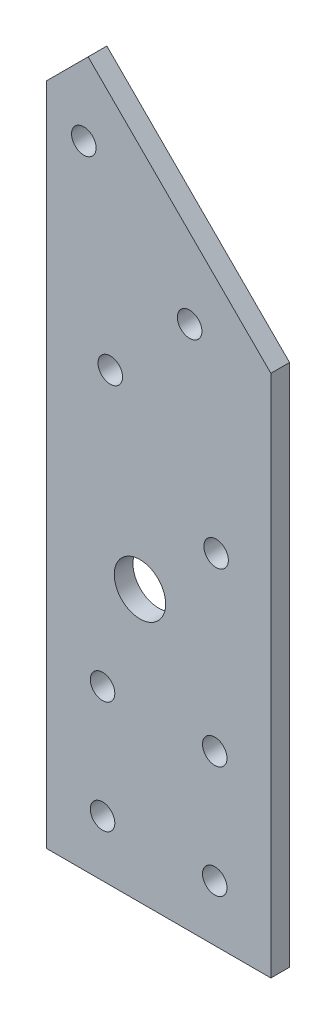
ISO-10303-21;
HEADER;
FILE_DESCRIPTION(('STEP AP214'),'2;1');
FILE_NAME('part.step','',(''),(''),'','','');
FILE_SCHEMA(('AUTOMOTIVE_DESIGN { 1 0 10303 214 1 1 1 1 }'));
ENDSEC;
DATA;
#1=APPLICATION_CONTEXT('core data for automotive mechanical design processes');
#2=APPLICATION_PROTOCOL_DEFINITION('international standard','automotive_design',2000,#1);
#3=PRODUCT_CONTEXT('',#1,'mechanical');
#4=PRODUCT('Part','Part','',(#3));
#5=PRODUCT_RELATED_PRODUCT_CATEGORY('part','',(#4));
#6=PRODUCT_DEFINITION_FORMATION('','',#4);
#7=PRODUCT_DEFINITION_CONTEXT('part definition',#1,'design');
#8=PRODUCT_DEFINITION('design','',#6,#7);
#9=PRODUCT_DEFINITION_SHAPE('','',#8);
#10=(LENGTH_UNIT() NAMED_UNIT(*) SI_UNIT(.MILLI.,.METRE.));
#11=(NAMED_UNIT(*) PLANE_ANGLE_UNIT() SI_UNIT($,.RADIAN.));
#12=(NAMED_UNIT(*) SI_UNIT($,.STERADIAN.) SOLID_ANGLE_UNIT());
#13=UNCERTAINTY_MEASURE_WITH_UNIT(LENGTH_MEASURE(1.E-05),#10,'distance_accuracy_value','');
#14=(GEOMETRIC_REPRESENTATION_CONTEXT(3) GLOBAL_UNCERTAINTY_ASSIGNED_CONTEXT((#13)) GLOBAL_UNIT_ASSIGNED_CONTEXT((#10,
#11,#12)) REPRESENTATION_CONTEXT('',''));
#15=CARTESIAN_POINT('',(0.,0.,0.));
#16=DIRECTION('',(0.,0.,1.));
#17=DIRECTION('',(1.,0.,0.));
#18=AXIS2_PLACEMENT_3D('',#15,#16,#17);
#19=CARTESIAN_POINT('',(19.05,57.15,6.35));
#20=DIRECTION('',(0.,0.,1.));
#21=DIRECTION('',(1.,0.,0.));
#22=AXIS2_PLACEMENT_3D('',#19,#20,#21);
#23=CYLINDRICAL_SURFACE('',#22,4.167251);
#24=CARTESIAN_POINT('',(19.05,57.15,0.));
#25=DIRECTION('',(0.,0.,1.));
#26=DIRECTION('',(1.,0.,0.));
#27=AXIS2_PLACEMENT_3D('',#24,#25,#26);
#28=CIRCLE('',#27,4.167251);
#29=CARTESIAN_POINT('',(23.217251,57.15,0.));
#30=VERTEX_POINT('',#29);
#31=EDGE_CURVE('E51',#30,#30,#28,.T.);
#32=ORIENTED_EDGE('',*,*,#31,.F.);
#33=EDGE_LOOP('',(#32));
#34=FACE_BOUND('',#33,.T.);
#35=CARTESIAN_POINT('',(19.05,57.15,6.35));
#36=DIRECTION('',(0.,0.,1.));
#37=DIRECTION('',(1.,0.,0.));
#38=AXIS2_PLACEMENT_3D('',#35,#36,#37);
#39=CIRCLE('',#38,4.167251);
#40=CARTESIAN_POINT('',(23.217251,57.15,6.35));
#41=VERTEX_POINT('',#40);
#42=EDGE_CURVE('E11',#41,#41,#39,.T.);
#43=ORIENTED_EDGE('',*,*,#42,.T.);
#44=EDGE_LOOP('',(#43));
#45=FACE_BOUND('',#44,.T.);
#46=ADVANCED_FACE('F43',(#34,#45),#23,.F.);
#47=CARTESIAN_POINT('',(57.15,57.15,6.35));
#48=DIRECTION('',(0.,0.,1.));
#49=DIRECTION('',(1.,0.,0.));
#50=AXIS2_PLACEMENT_3D('',#47,#48,#49);
#51=CYLINDRICAL_SURFACE('',#50,4.167251);
#52=CARTESIAN_POINT('',(57.15,57.15,0.));
#53=DIRECTION('',(0.,0.,1.));
#54=DIRECTION('',(1.,0.,0.));
#55=AXIS2_PLACEMENT_3D('',#52,#53,#54);
#56=CIRCLE('',#55,4.167251);
#57=CARTESIAN_POINT('',(61.317251,57.15,0.));
#58=VERTEX_POINT('',#57);
#59=EDGE_CURVE('E135',#58,#58,#56,.T.);
#60=ORIENTED_EDGE('',*,*,#59,.F.);
#61=EDGE_LOOP('',(#60));
#62=FACE_BOUND('',#61,.T.);
#63=CARTESIAN_POINT('',(57.15,57.15,6.35));
#64=DIRECTION('',(0.,0.,1.));
#65=DIRECTION('',(1.,0.,0.));
#66=AXIS2_PLACEMENT_3D('',#63,#64,#65);
#67=CIRCLE('',#66,4.167251);
#68=CARTESIAN_POINT('',(61.317251,57.15,6.35));
#69=VERTEX_POINT('',#68);
#70=EDGE_CURVE('E138',#69,#69,#67,.T.);
#71=ORIENTED_EDGE('',*,*,#70,.T.);
#72=EDGE_LOOP('',(#71));
#73=FACE_BOUND('',#72,.T.);
#74=ADVANCED_FACE('F147',(#62,#73),#51,.F.);
#75=CARTESIAN_POINT('',(5.27411613663484E-13,225.679613526569,6.35));
#76=DIRECTION('',(1.,0.,0.));
#77=DIRECTION('',(0.,1.,0.));
#78=AXIS2_PLACEMENT_3D('',#75,#76,#77);
#79=PLANE('',#78);
#80=DIRECTION('',(0.,-1.,0.));
#81=VECTOR('',#80,1.);
#82=CARTESIAN_POINT('',(5.27411613663484E-13,225.679613526569,0.));
#83=LINE('',#82,#81);
#84=CARTESIAN_POINT('',(5.27411613663484E-13,225.679613526569,0.));
#85=VERTEX_POINT('',#84);
#86=CARTESIAN_POINT('',(0.,0.,0.));
#87=VERTEX_POINT('',#86);
#88=EDGE_CURVE('E120',#85,#87,#83,.T.);
#89=ORIENTED_EDGE('',*,*,#88,.T.);
#90=DIRECTION('',(0.,0.,-1.));
#91=VECTOR('',#90,1.);
#92=CARTESIAN_POINT('',(0.,0.,6.35));
#93=LINE('',#92,#91);
#94=CARTESIAN_POINT('',(0.,0.,6.35));
#95=VERTEX_POINT('',#94);
#96=EDGE_CURVE('E133',#95,#87,#93,.T.);
#97=ORIENTED_EDGE('',*,*,#96,.F.);
#98=DIRECTION('',(0.,-1.,0.));
#99=VECTOR('',#98,1.);
#100=CARTESIAN_POINT('',(5.27411613663484E-13,225.679613526569,6.35));
#101=LINE('',#100,#99);
#102=CARTESIAN_POINT('',(5.27411613663484E-13,225.679613526569,6.35));
#103=VERTEX_POINT('',#102);
#104=EDGE_CURVE('E129',#103,#95,#101,.T.);
#105=ORIENTED_EDGE('',*,*,#104,.F.);
#106=DIRECTION('',(0.,0.,-1.));
#107=VECTOR('',#106,1.);
#108=CARTESIAN_POINT('',(5.27411613663484E-13,225.679613526569,6.35));
#109=LINE('',#108,#107);
#110=EDGE_CURVE('E116',#103,#85,#109,.T.);
#111=ORIENTED_EDGE('',*,*,#110,.T.);
#112=EDGE_LOOP('',(#89,#97,#105,#111));
#113=FACE_BOUND('',#112,.T.);
#114=ADVANCED_FACE('F175',(#113),#79,.F.);
#115=CARTESIAN_POINT('',(0.,0.,6.35));
#116=DIRECTION('',(0.,1.,0.));
#117=DIRECTION('',(0.,0.,1.));
#118=AXIS2_PLACEMENT_3D('',#115,#116,#117);
#119=PLANE('',#118);
#120=DIRECTION('',(1.,0.,0.));
#121=VECTOR('',#120,1.);
#122=CARTESIAN_POINT('',(0.,0.,0.));
#123=LINE('',#122,#121);
#124=CARTESIAN_POINT('',(76.2,0.,0.));
#125=VERTEX_POINT('',#124);
#126=EDGE_CURVE('E123',#87,#125,#123,.T.);
#127=ORIENTED_EDGE('',*,*,#126,.T.);
#128=DIRECTION('',(0.,0.,-1.));
#129=VECTOR('',#128,1.);
#130=CARTESIAN_POINT('',(76.2,0.,6.35));
#131=LINE('',#130,#129);
#132=CARTESIAN_POINT('',(76.2,0.,6.35));
#133=VERTEX_POINT('',#132);
#134=EDGE_CURVE('E111',#133,#125,#131,.T.);
#135=ORIENTED_EDGE('',*,*,#134,.F.);
#136=DIRECTION('',(1.,0.,0.));
#137=VECTOR('',#136,1.);
#138=CARTESIAN_POINT('',(0.,0.,6.35));
#139=LINE('',#138,#137);
#140=EDGE_CURVE('E94',#95,#133,#139,.T.);
#141=ORIENTED_EDGE('',*,*,#140,.F.);
#142=ORIENTED_EDGE('',*,*,#96,.T.);
#143=EDGE_LOOP('',(#127,#135,#141,#142));
#144=FACE_BOUND('',#143,.T.);
#145=ADVANCED_FACE('F172',(#144),#119,.F.);
#146=CARTESIAN_POINT('',(76.2,0.,6.35));
#147=DIRECTION('',(-1.,0.,0.));
#148=DIRECTION('',(0.,0.,1.));
#149=AXIS2_PLACEMENT_3D('',#146,#147,#148);
#150=PLANE('',#149);
#151=DIRECTION('',(0.,1.,0.));
#152=VECTOR('',#151,1.);
#153=CARTESIAN_POINT('',(76.2,0.,0.));
#154=LINE('',#153,#152);
#155=CARTESIAN_POINT('',(76.2,177.8,0.));
#156=VERTEX_POINT('',#155);
#157=EDGE_CURVE('E110',#125,#156,#154,.T.);
#158=ORIENTED_EDGE('',*,*,#157,.T.);
#159=DIRECTION('',(0.,0.,-1.));
#160=VECTOR('',#159,1.);
#161=CARTESIAN_POINT('',(76.2,177.8,6.35));
#162=LINE('',#161,#160);
#163=CARTESIAN_POINT('',(76.2,177.8,6.35));
#164=VERTEX_POINT('',#163);
#165=EDGE_CURVE('E107',#164,#156,#162,.T.);
#166=ORIENTED_EDGE('',*,*,#165,.F.);
#167=DIRECTION('',(0.,1.,0.));
#168=VECTOR('',#167,1.);
#169=CARTESIAN_POINT('',(76.2,0.,6.35));
#170=LINE('',#169,#168);
#171=EDGE_CURVE('E98',#133,#164,#170,.T.);
#172=ORIENTED_EDGE('',*,*,#171,.F.);
#173=ORIENTED_EDGE('',*,*,#134,.T.);
#174=EDGE_LOOP('',(#158,#166,#172,#173));
#175=FACE_BOUND('',#174,.T.);
#176=ADVANCED_FACE('F108',(#175),#150,.F.);
#177=CARTESIAN_POINT('',(76.2,177.8,6.35));
#178=DIRECTION('',(-0.707106781186543,-0.707106781186551,0.));
#179=DIRECTION('',(0.707106781186551,-0.707106781186544,0.));
#180=AXIS2_PLACEMENT_3D('',#177,#178,#179);
#181=PLANE('',#180);
#182=DIRECTION('',(-0.707106781186552,0.707106781186544,0.));
#183=VECTOR('',#182,1.);
#184=CARTESIAN_POINT('',(76.2,177.8,0.));
#185=LINE('',#184,#183);
#186=CARTESIAN_POINT('',(14.1601932367152,239.839806763284,0.));
#187=VERTEX_POINT('',#186);
#188=EDGE_CURVE('E79',#156,#187,#185,.T.);
#189=ORIENTED_EDGE('',*,*,#188,.T.);
#190=DIRECTION('',(0.,0.,-1.));
#191=VECTOR('',#190,1.);
#192=CARTESIAN_POINT('',(14.1601932367152,239.839806763284,6.35));
#193=LINE('',#192,#191);
#194=CARTESIAN_POINT('',(14.1601932367152,239.839806763284,6.35));
#195=VERTEX_POINT('',#194);
#196=EDGE_CURVE('E112',#195,#187,#193,.T.);
#197=ORIENTED_EDGE('',*,*,#196,.F.);
#198=DIRECTION('',(-0.707106781186552,0.707106781186544,0.));
#199=VECTOR('',#198,1.);
#200=CARTESIAN_POINT('',(76.2,177.8,6.35));
#201=LINE('',#200,#199);
#202=EDGE_CURVE('E103',#164,#195,#201,.T.);
#203=ORIENTED_EDGE('',*,*,#202,.F.);
#204=ORIENTED_EDGE('',*,*,#165,.T.);
#205=EDGE_LOOP('',(#189,#197,#203,#204));
#206=FACE_BOUND('',#205,.T.);
#207=ADVANCED_FACE('F114',(#206),#181,.F.);
#208=CARTESIAN_POINT('',(14.1601932367152,239.839806763284,6.35));
#209=DIRECTION('',(0.707106781186551,-0.707106781186544,0.));
#210=DIRECTION('',(0.707106781186544,0.707106781186551,0.));
#211=AXIS2_PLACEMENT_3D('',#208,#209,#210);
#212=PLANE('',#211);
#213=DIRECTION('',(-0.707106781186544,-0.707106781186551,0.));
#214=VECTOR('',#213,1.);
#215=CARTESIAN_POINT('',(14.1601932367152,239.839806763284,0.));
#216=LINE('',#215,#214);
#217=EDGE_CURVE('E85',#187,#85,#216,.T.);
#218=ORIENTED_EDGE('',*,*,#217,.T.);
#219=ORIENTED_EDGE('',*,*,#110,.F.);
#220=DIRECTION('',(-0.707106781186544,-0.707106781186551,0.));
#221=VECTOR('',#220,1.);
#222=CARTESIAN_POINT('',(14.1601932367152,239.839806763284,6.35));
#223=LINE('',#222,#221);
#224=EDGE_CURVE('E59',#195,#103,#223,.T.);
#225=ORIENTED_EDGE('',*,*,#224,.F.);
#226=ORIENTED_EDGE('',*,*,#196,.T.);
#227=EDGE_LOOP('',(#218,#219,#225,#226));
#228=FACE_BOUND('',#227,.T.);
#229=ADVANCED_FACE('F151',(#228),#212,.F.);
#230=CARTESIAN_POINT('',(0.,0.,6.35));
#231=DIRECTION('',(0.,0.,1.));
#232=DIRECTION('',(1.,0.,0.));
#233=AXIS2_PLACEMENT_3D('',#230,#231,#232);
#234=PLANE('',#233);
#235=CARTESIAN_POINT('',(31.7500000000005,92.075,6.35));
#236=DIRECTION('',(0.,0.,1.));
#237=DIRECTION('',(1.,0.,0.));
#238=AXIS2_PLACEMENT_3D('',#235,#236,#237);
#239=CIRCLE('',#238,8.73125);
#240=CARTESIAN_POINT('',(40.4812500000005,92.075,6.35));
#241=VERTEX_POINT('',#240);
#242=EDGE_CURVE('E318',#241,#241,#239,.T.);
#243=ORIENTED_EDGE('',*,*,#242,.F.);
#244=EDGE_LOOP('',(#243));
#245=FACE_BOUND('',#244,.T.);
#246=CARTESIAN_POINT('',(57.6012806053468,115.576414305032,6.35));
#247=DIRECTION('',(0.,0.,1.));
#248=DIRECTION('',(1.,0.,0.));
#249=AXIS2_PLACEMENT_3D('',#246,#247,#248);
#250=CIRCLE('',#249,4.167251);
#251=CARTESIAN_POINT('',(61.7685316053468,115.576414305032,6.35));
#252=VERTEX_POINT('',#251);
#253=EDGE_CURVE('E312',#252,#252,#250,.T.);
#254=ORIENTED_EDGE('',*,*,#253,.F.);
#255=EDGE_LOOP('',(#254));
#256=FACE_BOUND('',#255,.T.);
#257=CARTESIAN_POINT('',(21.68025612107,151.497438789308,6.35));
#258=DIRECTION('',(0.,0.,1.));
#259=DIRECTION('',(1.,0.,0.));
#260=AXIS2_PLACEMENT_3D('',#257,#258,#259);
#261=CIRCLE('',#260,4.167251);
#262=CARTESIAN_POINT('',(25.84750712107,151.497438789308,6.35));
#263=VERTEX_POINT('',#262);
#264=EDGE_CURVE('E306',#263,#263,#261,.T.);
#265=ORIENTED_EDGE('',*,*,#264,.F.);
#266=EDGE_LOOP('',(#265));
#267=FACE_BOUND('',#266,.T.);
#268=CARTESIAN_POINT('',(48.6210244842773,178.438207152516,6.35));
#269=DIRECTION('',(0.,0.,1.));
#270=DIRECTION('',(1.,0.,0.));
#271=AXIS2_PLACEMENT_3D('',#268,#269,#270);
#272=CIRCLE('',#271,4.167251);
#273=CARTESIAN_POINT('',(52.7882754842773,178.438207152516,6.35));
#274=VERTEX_POINT('',#273);
#275=EDGE_CURVE('E300',#274,#274,#272,.T.);
#276=ORIENTED_EDGE('',*,*,#275,.F.);
#277=EDGE_LOOP('',(#276));
#278=FACE_BOUND('',#277,.T.);
#279=CARTESIAN_POINT('',(12.7000000000005,214.359231636792,6.35));
#280=DIRECTION('',(0.,0.,1.));
#281=DIRECTION('',(1.,0.,0.));
#282=AXIS2_PLACEMENT_3D('',#279,#280,#281);
#283=CIRCLE('',#282,4.167251);
#284=CARTESIAN_POINT('',(16.8672510000005,214.359231636792,6.35));
#285=VERTEX_POINT('',#284);
#286=EDGE_CURVE('E294',#285,#285,#283,.T.);
#287=ORIENTED_EDGE('',*,*,#286,.F.);
#288=EDGE_LOOP('',(#287));
#289=FACE_BOUND('',#288,.T.);
#290=CARTESIAN_POINT('',(19.05,19.05,6.35));
#291=DIRECTION('',(0.,0.,1.));
#292=DIRECTION('',(1.,0.,0.));
#293=AXIS2_PLACEMENT_3D('',#290,#291,#292);
#294=CIRCLE('',#293,4.167251);
#295=CARTESIAN_POINT('',(23.217251,19.05,6.35));
#296=VERTEX_POINT('',#295);
#297=EDGE_CURVE('E277',#296,#296,#294,.T.);
#298=ORIENTED_EDGE('',*,*,#297,.F.);
#299=EDGE_LOOP('',(#298));
#300=FACE_BOUND('',#299,.T.);
#301=CARTESIAN_POINT('',(57.15,19.05,6.35));
#302=DIRECTION('',(0.,0.,1.));
#303=DIRECTION('',(1.,0.,0.));
#304=AXIS2_PLACEMENT_3D('',#301,#302,#303);
#305=CIRCLE('',#304,4.167251);
#306=CARTESIAN_POINT('',(61.317251,19.05,6.35));
#307=VERTEX_POINT('',#306);
#308=EDGE_CURVE('E275',#307,#307,#305,.T.);
#309=ORIENTED_EDGE('',*,*,#308,.F.);
#310=EDGE_LOOP('',(#309));
#311=FACE_BOUND('',#310,.T.);
#312=ORIENTED_EDGE('',*,*,#104,.T.);
#313=ORIENTED_EDGE('',*,*,#140,.T.);
#314=ORIENTED_EDGE('',*,*,#171,.T.);
#315=ORIENTED_EDGE('',*,*,#202,.T.);
#316=ORIENTED_EDGE('',*,*,#224,.T.);
#317=EDGE_LOOP('',(#312,#313,#314,#315,#316));
#318=FACE_BOUND('',#317,.T.);
#319=ORIENTED_EDGE('',*,*,#70,.F.);
#320=EDGE_LOOP('',(#319));
#321=FACE_BOUND('',#320,.T.);
#322=ORIENTED_EDGE('',*,*,#42,.F.);
#323=EDGE_LOOP('',(#322));
#324=FACE_BOUND('',#323,.T.);
#325=ADVANCED_FACE('F100',(#245,#256,#267,#278,#289,#300,#311,#318,#321,#324),#234,.T.);
#326=CARTESIAN_POINT('',(0.,0.,0.));
#327=DIRECTION('',(0.,0.,1.));
#328=DIRECTION('',(1.,0.,0.));
#329=AXIS2_PLACEMENT_3D('',#326,#327,#328);
#330=PLANE('',#329);
#331=CARTESIAN_POINT('',(31.7500000000005,92.075,0.));
#332=DIRECTION('',(0.,0.,1.));
#333=DIRECTION('',(1.,0.,0.));
#334=AXIS2_PLACEMENT_3D('',#331,#332,#333);
#335=CIRCLE('',#334,8.73125);
#336=CARTESIAN_POINT('',(40.4812500000005,92.075,0.));
#337=VERTEX_POINT('',#336);
#338=EDGE_CURVE('E315',#337,#337,#335,.T.);
#339=ORIENTED_EDGE('',*,*,#338,.T.);
#340=EDGE_LOOP('',(#339));
#341=FACE_BOUND('',#340,.T.);
#342=CARTESIAN_POINT('',(57.6012806053468,115.576414305032,0.));
#343=DIRECTION('',(0.,0.,1.));
#344=DIRECTION('',(1.,0.,0.));
#345=AXIS2_PLACEMENT_3D('',#342,#343,#344);
#346=CIRCLE('',#345,4.167251);
#347=CARTESIAN_POINT('',(61.7685316053468,115.576414305032,0.));
#348=VERTEX_POINT('',#347);
#349=EDGE_CURVE('E309',#348,#348,#346,.T.);
#350=ORIENTED_EDGE('',*,*,#349,.T.);
#351=EDGE_LOOP('',(#350));
#352=FACE_BOUND('',#351,.T.);
#353=CARTESIAN_POINT('',(21.68025612107,151.497438789308,0.));
#354=DIRECTION('',(0.,0.,1.));
#355=DIRECTION('',(1.,0.,0.));
#356=AXIS2_PLACEMENT_3D('',#353,#354,#355);
#357=CIRCLE('',#356,4.167251);
#358=CARTESIAN_POINT('',(25.84750712107,151.497438789308,0.));
#359=VERTEX_POINT('',#358);
#360=EDGE_CURVE('E303',#359,#359,#357,.T.);
#361=ORIENTED_EDGE('',*,*,#360,.T.);
#362=EDGE_LOOP('',(#361));
#363=FACE_BOUND('',#362,.T.);
#364=CARTESIAN_POINT('',(48.6210244842773,178.438207152516,0.));
#365=DIRECTION('',(0.,0.,1.));
#366=DIRECTION('',(1.,0.,0.));
#367=AXIS2_PLACEMENT_3D('',#364,#365,#366);
#368=CIRCLE('',#367,4.167251);
#369=CARTESIAN_POINT('',(52.7882754842773,178.438207152516,0.));
#370=VERTEX_POINT('',#369);
#371=EDGE_CURVE('E297',#370,#370,#368,.T.);
#372=ORIENTED_EDGE('',*,*,#371,.T.);
#373=EDGE_LOOP('',(#372));
#374=FACE_BOUND('',#373,.T.);
#375=CARTESIAN_POINT('',(12.7000000000005,214.359231636792,0.));
#376=DIRECTION('',(0.,0.,1.));
#377=DIRECTION('',(1.,0.,0.));
#378=AXIS2_PLACEMENT_3D('',#375,#376,#377);
#379=CIRCLE('',#378,4.167251);
#380=CARTESIAN_POINT('',(16.8672510000005,214.359231636792,0.));
#381=VERTEX_POINT('',#380);
#382=EDGE_CURVE('E291',#381,#381,#379,.T.);
#383=ORIENTED_EDGE('',*,*,#382,.T.);
#384=EDGE_LOOP('',(#383));
#385=FACE_BOUND('',#384,.T.);
#386=CARTESIAN_POINT('',(19.05,19.05,0.));
#387=DIRECTION('',(0.,0.,1.));
#388=DIRECTION('',(1.,0.,0.));
#389=AXIS2_PLACEMENT_3D('',#386,#387,#388);
#390=CIRCLE('',#389,4.167251);
#391=CARTESIAN_POINT('',(23.217251,19.05,0.));
#392=VERTEX_POINT('',#391);
#393=EDGE_CURVE('E281',#392,#392,#390,.T.);
#394=ORIENTED_EDGE('',*,*,#393,.T.);
#395=EDGE_LOOP('',(#394));
#396=FACE_BOUND('',#395,.T.);
#397=CARTESIAN_POINT('',(57.15,19.05,0.));
#398=DIRECTION('',(0.,0.,1.));
#399=DIRECTION('',(1.,0.,0.));
#400=AXIS2_PLACEMENT_3D('',#397,#398,#399);
#401=CIRCLE('',#400,4.167251);
#402=CARTESIAN_POINT('',(61.317251,19.05,0.));
#403=VERTEX_POINT('',#402);
#404=EDGE_CURVE('E124',#403,#403,#401,.T.);
#405=ORIENTED_EDGE('',*,*,#404,.T.);
#406=EDGE_LOOP('',(#405));
#407=FACE_BOUND('',#406,.T.);
#408=ORIENTED_EDGE('',*,*,#88,.F.);
#409=ORIENTED_EDGE('',*,*,#217,.F.);
#410=ORIENTED_EDGE('',*,*,#188,.F.);
#411=ORIENTED_EDGE('',*,*,#157,.F.);
#412=ORIENTED_EDGE('',*,*,#126,.F.);
#413=EDGE_LOOP('',(#408,#409,#410,#411,#412));
#414=FACE_BOUND('',#413,.T.);
#415=ORIENTED_EDGE('',*,*,#59,.T.);
#416=EDGE_LOOP('',(#415));
#417=FACE_BOUND('',#416,.T.);
#418=ORIENTED_EDGE('',*,*,#31,.T.);
#419=EDGE_LOOP('',(#418));
#420=FACE_BOUND('',#419,.T.);
#421=ADVANCED_FACE('F143',(#341,#352,#363,#374,#385,#396,#407,#414,#417,#420),#330,.F.);
#422=CARTESIAN_POINT('',(57.15,19.05,6.35));
#423=DIRECTION('',(0.,0.,1.));
#424=DIRECTION('',(1.,0.,0.));
#425=AXIS2_PLACEMENT_3D('',#422,#423,#424);
#426=CYLINDRICAL_SURFACE('',#425,4.167251);
#427=ORIENTED_EDGE('',*,*,#404,.F.);
#428=EDGE_LOOP('',(#427));
#429=FACE_BOUND('',#428,.T.);
#430=ORIENTED_EDGE('',*,*,#308,.T.);
#431=EDGE_LOOP('',(#430));
#432=FACE_BOUND('',#431,.T.);
#433=ADVANCED_FACE('F158',(#429,#432),#426,.F.);
#434=CARTESIAN_POINT('',(19.05,19.05,6.35));
#435=DIRECTION('',(0.,0.,1.));
#436=DIRECTION('',(1.,0.,0.));
#437=AXIS2_PLACEMENT_3D('',#434,#435,#436);
#438=CYLINDRICAL_SURFACE('',#437,4.167251);
#439=ORIENTED_EDGE('',*,*,#393,.F.);
#440=EDGE_LOOP('',(#439));
#441=FACE_BOUND('',#440,.T.);
#442=ORIENTED_EDGE('',*,*,#297,.T.);
#443=EDGE_LOOP('',(#442));
#444=FACE_BOUND('',#443,.T.);
#445=ADVANCED_FACE('F193',(#441,#444),#438,.F.);
#446=CARTESIAN_POINT('',(12.7000000000005,214.359231636792,6.35));
#447=DIRECTION('',(0.,0.,1.));
#448=DIRECTION('',(1.,0.,0.));
#449=AXIS2_PLACEMENT_3D('',#446,#447,#448);
#450=CYLINDRICAL_SURFACE('',#449,4.167251);
#451=ORIENTED_EDGE('',*,*,#382,.F.);
#452=EDGE_LOOP('',(#451));
#453=FACE_BOUND('',#452,.T.);
#454=ORIENTED_EDGE('',*,*,#286,.T.);
#455=EDGE_LOOP('',(#454));
#456=FACE_BOUND('',#455,.T.);
#457=ADVANCED_FACE('F196',(#453,#456),#450,.F.);
#458=CARTESIAN_POINT('',(48.6210244842773,178.438207152516,6.35));
#459=DIRECTION('',(0.,0.,1.));
#460=DIRECTION('',(1.,0.,0.));
#461=AXIS2_PLACEMENT_3D('',#458,#459,#460);
#462=CYLINDRICAL_SURFACE('',#461,4.167251);
#463=ORIENTED_EDGE('',*,*,#371,.F.);
#464=EDGE_LOOP('',(#463));
#465=FACE_BOUND('',#464,.T.);
#466=ORIENTED_EDGE('',*,*,#275,.T.);
#467=EDGE_LOOP('',(#466));
#468=FACE_BOUND('',#467,.T.);
#469=ADVANCED_FACE('F203',(#465,#468),#462,.F.);
#470=CARTESIAN_POINT('',(21.68025612107,151.497438789308,6.35));
#471=DIRECTION('',(0.,0.,1.));
#472=DIRECTION('',(1.,0.,0.));
#473=AXIS2_PLACEMENT_3D('',#470,#471,#472);
#474=CYLINDRICAL_SURFACE('',#473,4.167251);
#475=ORIENTED_EDGE('',*,*,#360,.F.);
#476=EDGE_LOOP('',(#475));
#477=FACE_BOUND('',#476,.T.);
#478=ORIENTED_EDGE('',*,*,#264,.T.);
#479=EDGE_LOOP('',(#478));
#480=FACE_BOUND('',#479,.T.);
#481=ADVANCED_FACE('F211',(#477,#480),#474,.F.);
#482=CARTESIAN_POINT('',(57.6012806053468,115.576414305032,6.35));
#483=DIRECTION('',(0.,0.,1.));
#484=DIRECTION('',(1.,0.,0.));
#485=AXIS2_PLACEMENT_3D('',#482,#483,#484);
#486=CYLINDRICAL_SURFACE('',#485,4.167251);
#487=ORIENTED_EDGE('',*,*,#349,.F.);
#488=EDGE_LOOP('',(#487));
#489=FACE_BOUND('',#488,.T.);
#490=ORIENTED_EDGE('',*,*,#253,.T.);
#491=EDGE_LOOP('',(#490));
#492=FACE_BOUND('',#491,.T.);
#493=ADVANCED_FACE('F218',(#489,#492),#486,.F.);
#494=CARTESIAN_POINT('',(31.7500000000005,92.075,6.35));
#495=DIRECTION('',(0.,0.,1.));
#496=DIRECTION('',(1.,0.,0.));
#497=AXIS2_PLACEMENT_3D('',#494,#495,#496);
#498=CYLINDRICAL_SURFACE('',#497,8.73125);
#499=ORIENTED_EDGE('',*,*,#338,.F.);
#500=EDGE_LOOP('',(#499));
#501=FACE_BOUND('',#500,.T.);
#502=ORIENTED_EDGE('',*,*,#242,.T.);
#503=EDGE_LOOP('',(#502));
#504=FACE_BOUND('',#503,.T.);
#505=ADVANCED_FACE('F225',(#501,#504),#498,.F.);
#506=CLOSED_SHELL('',(#46,#74,#114,#145,#176,#207,#229,#325,#421,#433,#445,#457,#469,#481,#493,#505));
#507=MANIFOLD_SOLID_BREP('B2',#506);
#508=ADVANCED_BREP_SHAPE_REPRESENTATION('',(#18,#507),#14);
#509=SHAPE_DEFINITION_REPRESENTATION(#9,#508);
ENDSEC;
END-ISO-10303-21;
